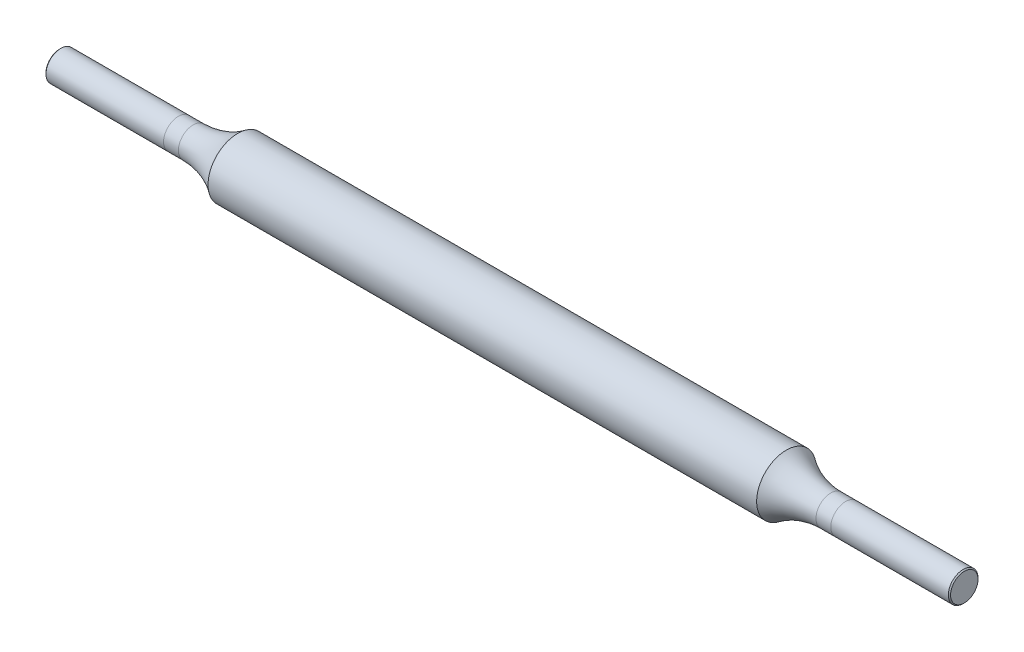
ISO-10303-21;
HEADER;
FILE_DESCRIPTION(('STEP AP214'),'2;1');
FILE_NAME('part.step','',(''),(''),'','','');
FILE_SCHEMA(('AUTOMOTIVE_DESIGN { 1 0 10303 214 1 1 1 1 }'));
ENDSEC;
DATA;
#1=APPLICATION_CONTEXT('core data for automotive mechanical design processes');
#2=APPLICATION_PROTOCOL_DEFINITION('international standard','automotive_design',2000,#1);
#3=PRODUCT_CONTEXT('',#1,'mechanical');
#4=PRODUCT('Part','Part','',(#3));
#5=PRODUCT_RELATED_PRODUCT_CATEGORY('part','',(#4));
#6=PRODUCT_DEFINITION_FORMATION('','',#4);
#7=PRODUCT_DEFINITION_CONTEXT('part definition',#1,'design');
#8=PRODUCT_DEFINITION('design','',#6,#7);
#9=PRODUCT_DEFINITION_SHAPE('','',#8);
#10=(LENGTH_UNIT() NAMED_UNIT(*) SI_UNIT(.MILLI.,.METRE.));
#11=(NAMED_UNIT(*) PLANE_ANGLE_UNIT() SI_UNIT($,.RADIAN.));
#12=(NAMED_UNIT(*) SI_UNIT($,.STERADIAN.) SOLID_ANGLE_UNIT());
#13=UNCERTAINTY_MEASURE_WITH_UNIT(LENGTH_MEASURE(1.E-05),#10,'distance_accuracy_value','');
#14=(GEOMETRIC_REPRESENTATION_CONTEXT(3) GLOBAL_UNCERTAINTY_ASSIGNED_CONTEXT((#13)) GLOBAL_UNIT_ASSIGNED_CONTEXT((#10,
#11,#12)) REPRESENTATION_CONTEXT('',''));
#15=CARTESIAN_POINT('',(0.,0.,0.));
#16=DIRECTION('',(0.,0.,1.));
#17=DIRECTION('',(1.,0.,0.));
#18=AXIS2_PLACEMENT_3D('',#15,#16,#17);
#19=CARTESIAN_POINT('',(-30.49,0.,0.));
#20=DIRECTION('',(-1.,0.,0.));
#21=DIRECTION('',(0.,0.,1.));
#22=AXIS2_PLACEMENT_3D('',#19,#20,#21);
#23=CYLINDRICAL_SURFACE('',#22,1.);
#24=CARTESIAN_POINT('',(21.49,0.,0.));
#25=DIRECTION('',(-1.,0.,0.));
#26=DIRECTION('',(0.,0.,1.));
#27=AXIS2_PLACEMENT_3D('',#24,#25,#26);
#28=CIRCLE('',#27,1.);
#29=CARTESIAN_POINT('',(21.49,0.,1.));
#30=VERTEX_POINT('',#29);
#31=EDGE_CURVE('E70',#30,#30,#28,.T.);
#32=ORIENTED_EDGE('',*,*,#31,.F.);
#33=EDGE_LOOP('',(#32));
#34=FACE_BOUND('',#33,.T.);
#35=CARTESIAN_POINT('',(22.49,0.,0.));
#36=DIRECTION('',(1.,0.,0.));
#37=DIRECTION('',(0.,0.,-1.));
#38=AXIS2_PLACEMENT_3D('',#35,#36,#37);
#39=CIRCLE('',#38,1.);
#40=CARTESIAN_POINT('',(22.49,0.,-1.));
#41=VERTEX_POINT('',#40);
#42=EDGE_CURVE('E62',#41,#41,#39,.T.);
#43=ORIENTED_EDGE('',*,*,#42,.F.);
#44=EDGE_LOOP('',(#43));
#45=FACE_BOUND('',#44,.T.);
#46=ADVANCED_FACE('F41',(#34,#45),#23,.T.);
#47=CARTESIAN_POINT('',(-30.49,0.,0.));
#48=DIRECTION('',(-1.,0.,0.));
#49=DIRECTION('',(0.,0.,1.));
#50=AXIS2_PLACEMENT_3D('',#47,#48,#49);
#51=CYLINDRICAL_SURFACE('',#50,1.);
#52=CARTESIAN_POINT('',(-30.415,0.,0.));
#53=DIRECTION('',(1.,0.,0.));
#54=DIRECTION('',(0.,0.,-1.));
#55=AXIS2_PLACEMENT_3D('',#52,#53,#54);
#56=CIRCLE('',#55,1.);
#57=CARTESIAN_POINT('',(-30.415,0.,-1.));
#58=VERTEX_POINT('',#57);
#59=EDGE_CURVE('E53',#58,#58,#56,.T.);
#60=ORIENTED_EDGE('',*,*,#59,.T.);
#61=EDGE_LOOP('',(#60));
#62=FACE_BOUND('',#61,.T.);
#63=CARTESIAN_POINT('',(-22.49,0.,0.));
#64=DIRECTION('',(1.,0.,0.));
#65=DIRECTION('',(0.,1.,0.));
#66=AXIS2_PLACEMENT_3D('',#63,#64,#65);
#67=CIRCLE('',#66,1.);
#68=CARTESIAN_POINT('',(-22.49,0.999999999999989,0.));
#69=VERTEX_POINT('',#68);
#70=EDGE_CURVE('E66',#69,#69,#67,.T.);
#71=ORIENTED_EDGE('',*,*,#70,.F.);
#72=EDGE_LOOP('',(#71));
#73=FACE_BOUND('',#72,.T.);
#74=ADVANCED_FACE('F106',(#62,#73),#51,.T.);
#75=CARTESIAN_POINT('',(-30.49,0.,0.));
#76=DIRECTION('',(1.,0.,0.));
#77=DIRECTION('',(0.,0.,-1.));
#78=AXIS2_PLACEMENT_3D('',#75,#76,#77);
#79=PLANE('',#78);
#80=CARTESIAN_POINT('',(-30.49,0.,0.));
#81=DIRECTION('',(1.,0.,0.));
#82=DIRECTION('',(0.,0.,-1.));
#83=AXIS2_PLACEMENT_3D('',#80,#81,#82);
#84=CIRCLE('',#83,0.925000000000023);
#85=CARTESIAN_POINT('',(-30.49,0.,-0.925000000000023));
#86=VERTEX_POINT('',#85);
#87=EDGE_CURVE('E57',#86,#86,#84,.F.);
#88=ORIENTED_EDGE('',*,*,#87,.T.);
#89=EDGE_LOOP('',(#88));
#90=FACE_BOUND('',#89,.T.);
#91=ADVANCED_FACE('F115',(#90),#79,.F.);
#92=CARTESIAN_POINT('',(30.49,0.,0.));
#93=DIRECTION('',(-1.,0.,0.));
#94=DIRECTION('',(0.,0.,1.));
#95=AXIS2_PLACEMENT_3D('',#92,#93,#94);
#96=PLANE('',#95);
#97=CARTESIAN_POINT('',(30.49,0.,0.));
#98=DIRECTION('',(-1.,0.,0.));
#99=DIRECTION('',(0.,0.,1.));
#100=AXIS2_PLACEMENT_3D('',#97,#98,#99);
#101=CIRCLE('',#100,0.924999999999981);
#102=CARTESIAN_POINT('',(30.49,0.,0.924999999999981));
#103=VERTEX_POINT('',#102);
#104=EDGE_CURVE('E10',#103,#103,#101,.F.);
#105=ORIENTED_EDGE('',*,*,#104,.T.);
#106=EDGE_LOOP('',(#105));
#107=FACE_BOUND('',#106,.T.);
#108=ADVANCED_FACE('F111',(#107),#96,.F.);
#109=CARTESIAN_POINT('',(30.415,0.,0.));
#110=DIRECTION('',(-1.,0.,0.));
#111=DIRECTION('',(0.,0.,1.));
#112=AXIS2_PLACEMENT_3D('',#109,#110,#111);
#113=CIRCLE('',#112,1.);
#114=CARTESIAN_POINT('',(30.415,0.,1.));
#115=VERTEX_POINT('',#114);
#116=EDGE_CURVE('E49',#115,#115,#113,.T.);
#117=ORIENTED_EDGE('',*,*,#116,.T.);
#118=EDGE_LOOP('',(#117));
#119=FACE_BOUND('',#118,.T.);
#120=ORIENTED_EDGE('',*,*,#42,.T.);
#121=EDGE_LOOP('',(#120));
#122=FACE_BOUND('',#121,.T.);
#123=ADVANCED_FACE('F100',(#119,#122),#23,.T.);
#124=CARTESIAN_POINT('',(21.49,0.,0.));
#125=DIRECTION('',(-1.,0.,0.));
#126=DIRECTION('',(0.,0.,1.));
#127=AXIS2_PLACEMENT_3D('',#124,#125,#126);
#128=TOROIDAL_SURFACE('',#127,6.00000000000002,5.00000000000002);
#129=CARTESIAN_POINT('',(18.49,0.,0.));
#130=DIRECTION('',(-1.,0.,0.));
#131=DIRECTION('',(0.,0.,1.));
#132=AXIS2_PLACEMENT_3D('',#129,#130,#131);
#133=CIRCLE('',#132,2.);
#134=CARTESIAN_POINT('',(18.49,0.,2.));
#135=VERTEX_POINT('',#134);
#136=EDGE_CURVE('E73',#135,#135,#133,.T.);
#137=ORIENTED_EDGE('',*,*,#136,.F.);
#138=EDGE_LOOP('',(#137));
#139=FACE_BOUND('',#138,.T.);
#140=ORIENTED_EDGE('',*,*,#31,.T.);
#141=EDGE_LOOP('',(#140));
#142=FACE_BOUND('',#141,.T.);
#143=ADVANCED_FACE('F94',(#139,#142),#128,.F.);
#144=CARTESIAN_POINT('',(-30.49,0.,0.));
#145=DIRECTION('',(-1.,0.,0.));
#146=DIRECTION('',(0.,0.,1.));
#147=AXIS2_PLACEMENT_3D('',#144,#145,#146);
#148=CYLINDRICAL_SURFACE('',#147,2.);
#149=CARTESIAN_POINT('',(-18.49,0.,0.));
#150=DIRECTION('',(-1.,0.,0.));
#151=DIRECTION('',(0.,0.,1.));
#152=AXIS2_PLACEMENT_3D('',#149,#150,#151);
#153=CIRCLE('',#152,2.);
#154=CARTESIAN_POINT('',(-18.49,0.,2.));
#155=VERTEX_POINT('',#154);
#156=EDGE_CURVE('E76',#155,#155,#153,.T.);
#157=ORIENTED_EDGE('',*,*,#156,.F.);
#158=EDGE_LOOP('',(#157));
#159=FACE_BOUND('',#158,.T.);
#160=ORIENTED_EDGE('',*,*,#136,.T.);
#161=EDGE_LOOP('',(#160));
#162=FACE_BOUND('',#161,.T.);
#163=ADVANCED_FACE('F88',(#159,#162),#148,.T.);
#164=CARTESIAN_POINT('',(-21.49,0.,0.));
#165=DIRECTION('',(-1.,0.,0.));
#166=DIRECTION('',(0.,0.,1.));
#167=AXIS2_PLACEMENT_3D('',#164,#165,#166);
#168=TOROIDAL_SURFACE('',#167,6.,5.);
#169=CARTESIAN_POINT('',(-21.49,0.,0.));
#170=DIRECTION('',(-1.,0.,0.));
#171=DIRECTION('',(0.,0.,1.));
#172=AXIS2_PLACEMENT_3D('',#169,#170,#171);
#173=CIRCLE('',#172,1.);
#174=CARTESIAN_POINT('',(-21.49,0.,1.));
#175=VERTEX_POINT('',#174);
#176=EDGE_CURVE('E79',#175,#175,#173,.T.);
#177=ORIENTED_EDGE('',*,*,#176,.F.);
#178=EDGE_LOOP('',(#177));
#179=FACE_BOUND('',#178,.T.);
#180=ORIENTED_EDGE('',*,*,#156,.T.);
#181=EDGE_LOOP('',(#180));
#182=FACE_BOUND('',#181,.T.);
#183=ADVANCED_FACE('F85',(#179,#182),#168,.F.);
#184=ORIENTED_EDGE('',*,*,#70,.T.);
#185=EDGE_LOOP('',(#184));
#186=FACE_BOUND('',#185,.T.);
#187=ORIENTED_EDGE('',*,*,#176,.T.);
#188=EDGE_LOOP('',(#187));
#189=FACE_BOUND('',#188,.T.);
#190=ADVANCED_FACE('F83',(#186,#189),#51,.T.);
#191=CARTESIAN_POINT('',(-30.49,0.,0.));
#192=DIRECTION('',(1.,0.,0.));
#193=DIRECTION('',(0.,0.,-1.));
#194=AXIS2_PLACEMENT_3D('',#191,#192,#193);
#195=CONICAL_SURFACE('',#194,0.925000000000023,0.785398163397466);
#196=ORIENTED_EDGE('',*,*,#59,.F.);
#197=EDGE_LOOP('',(#196));
#198=FACE_BOUND('',#197,.T.);
#199=ORIENTED_EDGE('',*,*,#87,.F.);
#200=EDGE_LOOP('',(#199));
#201=FACE_BOUND('',#200,.T.);
#202=ADVANCED_FACE('F121',(#198,#201),#195,.T.);
#203=CARTESIAN_POINT('',(30.415,0.,0.));
#204=DIRECTION('',(-1.,0.,0.));
#205=DIRECTION('',(0.,0.,1.));
#206=AXIS2_PLACEMENT_3D('',#203,#204,#205);
#207=CONICAL_SURFACE('',#206,1.,0.785398163397405);
#208=ORIENTED_EDGE('',*,*,#104,.F.);
#209=EDGE_LOOP('',(#208));
#210=FACE_BOUND('',#209,.T.);
#211=ORIENTED_EDGE('',*,*,#116,.F.);
#212=EDGE_LOOP('',(#211));
#213=FACE_BOUND('',#212,.T.);
#214=ADVANCED_FACE('F44',(#210,#213),#207,.T.);
#215=CLOSED_SHELL('',(#46,#74,#91,#108,#123,#143,#163,#183,#190,#202,#214));
#216=MANIFOLD_SOLID_BREP('B2',#215);
#217=ADVANCED_BREP_SHAPE_REPRESENTATION('',(#18,#216),#14);
#218=SHAPE_DEFINITION_REPRESENTATION(#9,#217);
ENDSEC;
END-ISO-10303-21;
